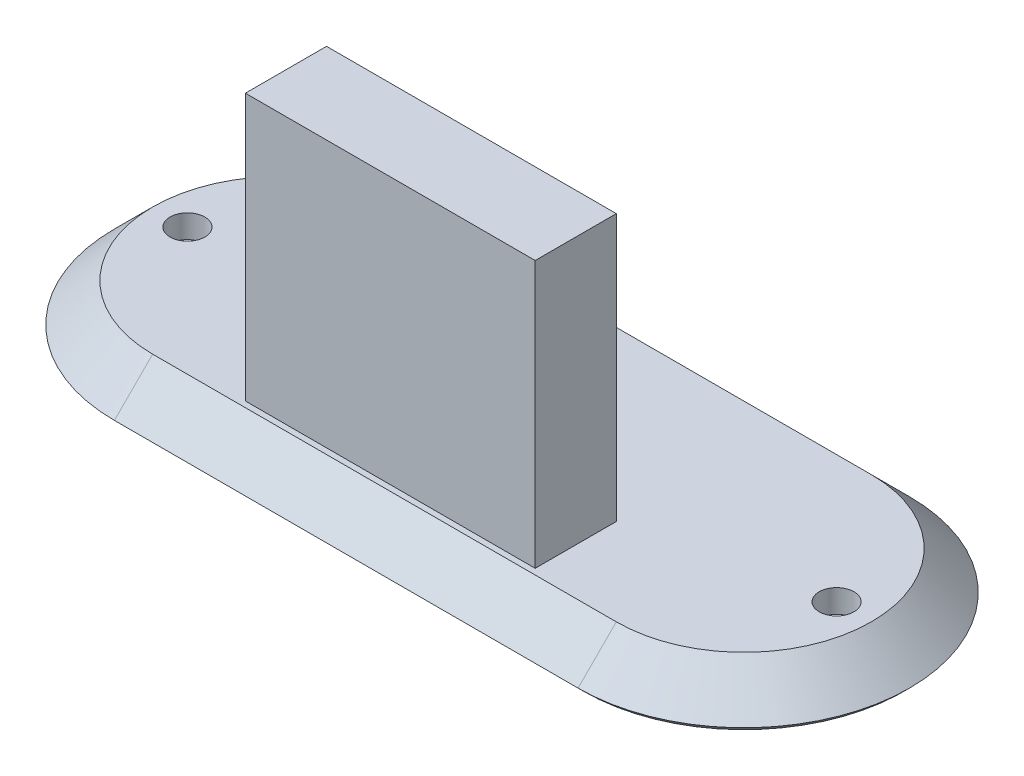
ISO-10303-21;
HEADER;
FILE_DESCRIPTION(('STEP AP214'),'2;1');
FILE_NAME('part.step','',(''),(''),'','','');
FILE_SCHEMA(('AUTOMOTIVE_DESIGN { 1 0 10303 214 1 1 1 1 }'));
ENDSEC;
DATA;
#1=APPLICATION_CONTEXT('core data for automotive mechanical design processes');
#2=APPLICATION_PROTOCOL_DEFINITION('international standard','automotive_design',2000,#1);
#3=PRODUCT_CONTEXT('',#1,'mechanical');
#4=PRODUCT('Part','Part','',(#3));
#5=PRODUCT_RELATED_PRODUCT_CATEGORY('part','',(#4));
#6=PRODUCT_DEFINITION_FORMATION('','',#4);
#7=PRODUCT_DEFINITION_CONTEXT('part definition',#1,'design');
#8=PRODUCT_DEFINITION('design','',#6,#7);
#9=PRODUCT_DEFINITION_SHAPE('','',#8);
#10=(LENGTH_UNIT() NAMED_UNIT(*) SI_UNIT(.MILLI.,.METRE.));
#11=(NAMED_UNIT(*) PLANE_ANGLE_UNIT() SI_UNIT($,.RADIAN.));
#12=(NAMED_UNIT(*) SI_UNIT($,.STERADIAN.) SOLID_ANGLE_UNIT());
#13=UNCERTAINTY_MEASURE_WITH_UNIT(LENGTH_MEASURE(1.E-05),#10,'distance_accuracy_value','');
#14=(GEOMETRIC_REPRESENTATION_CONTEXT(3) GLOBAL_UNCERTAINTY_ASSIGNED_CONTEXT((#13)) GLOBAL_UNIT_ASSIGNED_CONTEXT((#10,
#11,#12)) REPRESENTATION_CONTEXT('',''));
#15=CARTESIAN_POINT('',(0.,0.,0.));
#16=DIRECTION('',(0.,0.,1.));
#17=DIRECTION('',(1.,0.,0.));
#18=AXIS2_PLACEMENT_3D('',#15,#16,#17);
#19=CARTESIAN_POINT('',(-20.,3.8,0.));
#20=DIRECTION('',(0.,1.,0.));
#21=DIRECTION('',(0.,0.,1.));
#22=AXIS2_PLACEMENT_3D('',#19,#20,#21);
#23=PLANE('',#22);
#24=DIRECTION('',(0.,0.,1.));
#25=VECTOR('',#24,1.);
#26=CARTESIAN_POINT('',(-8.,3.8,8.5));
#27=LINE('',#26,#25);
#28=CARTESIAN_POINT('',(-8.,3.8,6.5));
#29=VERTEX_POINT('',#28);
#30=CARTESIAN_POINT('',(-8.,3.8,8.5));
#31=VERTEX_POINT('',#30);
#32=EDGE_CURVE('E58',#29,#31,#27,.T.);
#33=ORIENTED_EDGE('',*,*,#32,.F.);
#34=DIRECTION('',(-1.,0.,0.));
#35=VECTOR('',#34,1.);
#36=CARTESIAN_POINT('',(-8.,3.8,6.5));
#37=LINE('',#36,#35);
#38=CARTESIAN_POINT('',(8.,3.8,6.5));
#39=VERTEX_POINT('',#38);
#40=EDGE_CURVE('E201',#39,#29,#37,.T.);
#41=ORIENTED_EDGE('',*,*,#40,.F.);
#42=DIRECTION('',(0.,0.,-1.));
#43=VECTOR('',#42,1.);
#44=CARTESIAN_POINT('',(8.,3.8,8.5));
#45=LINE('',#44,#43);
#46=CARTESIAN_POINT('',(8.,3.8,8.5));
#47=VERTEX_POINT('',#46);
#48=EDGE_CURVE('E204',#47,#39,#45,.T.);
#49=ORIENTED_EDGE('',*,*,#48,.F.);
#50=DIRECTION('',(-1.,0.,0.));
#51=VECTOR('',#50,1.);
#52=CARTESIAN_POINT('',(-10.5,3.8,8.5));
#53=LINE('',#52,#51);
#54=CARTESIAN_POINT('',(10.5,3.8,8.5));
#55=VERTEX_POINT('',#54);
#56=EDGE_CURVE('E244',#55,#47,#53,.T.);
#57=ORIENTED_EDGE('',*,*,#56,.F.);
#58=DIRECTION('',(0.,0.,1.));
#59=VECTOR('',#58,1.);
#60=CARTESIAN_POINT('',(10.5,3.8,8.5));
#61=LINE('',#60,#59);
#62=CARTESIAN_POINT('',(10.5,3.8,3.5));
#63=VERTEX_POINT('',#62);
#64=EDGE_CURVE('E390',#63,#55,#61,.T.);
#65=ORIENTED_EDGE('',*,*,#64,.F.);
#66=DIRECTION('',(-1.,0.,0.));
#67=VECTOR('',#66,1.);
#68=CARTESIAN_POINT('',(10.5,3.8,3.5));
#69=LINE('',#68,#67);
#70=CARTESIAN_POINT('',(12.5,3.8,3.5));
#71=VERTEX_POINT('',#70);
#72=EDGE_CURVE('E388',#71,#63,#69,.T.);
#73=ORIENTED_EDGE('',*,*,#72,.F.);
#74=DIRECTION('',(0.,0.,-1.));
#75=VECTOR('',#74,1.);
#76=CARTESIAN_POINT('',(12.5,3.8,3.5));
#77=LINE('',#76,#75);
#78=CARTESIAN_POINT('',(12.5,3.8,10.5));
#79=VERTEX_POINT('',#78);
#80=EDGE_CURVE('E379',#79,#71,#77,.T.);
#81=ORIENTED_EDGE('',*,*,#80,.F.);
#82=DIRECTION('',(1.,0.,0.));
#83=VECTOR('',#82,1.);
#84=CARTESIAN_POINT('',(-12.5,3.8,10.5));
#85=LINE('',#84,#83);
#86=CARTESIAN_POINT('',(-12.5,3.8,10.5));
#87=VERTEX_POINT('',#86);
#88=EDGE_CURVE('E386',#87,#79,#85,.T.);
#89=ORIENTED_EDGE('',*,*,#88,.F.);
#90=DIRECTION('',(0.,0.,1.));
#91=VECTOR('',#90,1.);
#92=CARTESIAN_POINT('',(-12.5,3.8,3.5));
#93=LINE('',#92,#91);
#94=CARTESIAN_POINT('',(-12.5,3.8,3.5));
#95=VERTEX_POINT('',#94);
#96=EDGE_CURVE('E392',#95,#87,#93,.T.);
#97=ORIENTED_EDGE('',*,*,#96,.F.);
#98=DIRECTION('',(-1.,0.,0.));
#99=VECTOR('',#98,1.);
#100=CARTESIAN_POINT('',(-10.5,3.8,3.5));
#101=LINE('',#100,#99);
#102=CARTESIAN_POINT('',(-10.5,3.8,3.5));
#103=VERTEX_POINT('',#102);
#104=EDGE_CURVE('E405',#103,#95,#101,.T.);
#105=ORIENTED_EDGE('',*,*,#104,.F.);
#106=DIRECTION('',(0.,0.,-1.));
#107=VECTOR('',#106,1.);
#108=CARTESIAN_POINT('',(-10.5,3.8,8.5));
#109=LINE('',#108,#107);
#110=CARTESIAN_POINT('',(-10.5,3.8,8.5));
#111=VERTEX_POINT('',#110);
#112=EDGE_CURVE('E230',#111,#103,#109,.T.);
#113=ORIENTED_EDGE('',*,*,#112,.F.);
#114=EDGE_CURVE('E396',#31,#111,#53,.T.);
#115=ORIENTED_EDGE('',*,*,#114,.F.);
#116=EDGE_LOOP('',(#33,#41,#49,#57,#65,#73,#81,#89,#97,#105,#113,#115));
#117=FACE_BOUND('',#116,.T.);
#118=CARTESIAN_POINT('',(28.,3.8,0.));
#119=DIRECTION('',(0.,1.,0.));
#120=DIRECTION('',(0.,0.,-1.));
#121=AXIS2_PLACEMENT_3D('',#118,#119,#120);
#122=CIRCLE('',#121,1.5);
#123=CARTESIAN_POINT('',(28.,3.8,1.49999999999998));
#124=VERTEX_POINT('',#123);
#125=EDGE_CURVE('E248',#124,#124,#122,.T.);
#126=ORIENTED_EDGE('',*,*,#125,.F.);
#127=EDGE_LOOP('',(#126));
#128=FACE_BOUND('',#127,.T.);
#129=CARTESIAN_POINT('',(-28.,3.8,0.));
#130=DIRECTION('',(0.,1.,0.));
#131=DIRECTION('',(0.,0.,1.));
#132=AXIS2_PLACEMENT_3D('',#129,#130,#131);
#133=CIRCLE('',#132,1.5);
#134=CARTESIAN_POINT('',(-28.,3.8,1.5));
#135=VERTEX_POINT('',#134);
#136=EDGE_CURVE('E268',#135,#135,#133,.T.);
#137=ORIENTED_EDGE('',*,*,#136,.F.);
#138=EDGE_LOOP('',(#137));
#139=FACE_BOUND('',#138,.T.);
#140=CARTESIAN_POINT('',(-20.,3.8,0.));
#141=DIRECTION('',(0.,1.,0.));
#142=DIRECTION('',(0.,0.,1.));
#143=AXIS2_PLACEMENT_3D('',#140,#141,#142);
#144=CIRCLE('',#143,11.);
#145=CARTESIAN_POINT('',(-20.,3.8,-11.));
#146=VERTEX_POINT('',#145);
#147=CARTESIAN_POINT('',(-20.,3.8,11.));
#148=VERTEX_POINT('',#147);
#149=EDGE_CURVE('E278',#146,#148,#144,.T.);
#150=ORIENTED_EDGE('',*,*,#149,.T.);
#151=DIRECTION('',(-1.,0.,0.));
#152=VECTOR('',#151,1.);
#153=CARTESIAN_POINT('',(-20.,3.8,11.));
#154=LINE('',#153,#152);
#155=CARTESIAN_POINT('',(20.,3.8,11.));
#156=VERTEX_POINT('',#155);
#157=EDGE_CURVE('E324',#148,#156,#154,.F.);
#158=ORIENTED_EDGE('',*,*,#157,.T.);
#159=CARTESIAN_POINT('',(20.,3.8,0.));
#160=DIRECTION('',(0.,1.,0.));
#161=DIRECTION('',(0.,0.,1.));
#162=AXIS2_PLACEMENT_3D('',#159,#160,#161);
#163=CIRCLE('',#162,11.);
#164=CARTESIAN_POINT('',(20.,3.8,-11.));
#165=VERTEX_POINT('',#164);
#166=EDGE_CURVE('E326',#156,#165,#163,.T.);
#167=ORIENTED_EDGE('',*,*,#166,.T.);
#168=DIRECTION('',(1.,0.,0.));
#169=VECTOR('',#168,1.);
#170=CARTESIAN_POINT('',(-20.,3.8,-11.));
#171=LINE('',#170,#169);
#172=EDGE_CURVE('E317',#165,#146,#171,.F.);
#173=ORIENTED_EDGE('',*,*,#172,.T.);
#174=EDGE_LOOP('',(#150,#158,#167,#173));
#175=FACE_BOUND('',#174,.T.);
#176=ADVANCED_FACE('F33',(#117,#128,#139,#175),#23,.T.);
#177=CARTESIAN_POINT('',(-20.,0.,0.));
#178=DIRECTION('',(0.,-1.,0.));
#179=DIRECTION('',(0.,0.,1.));
#180=AXIS2_PLACEMENT_3D('',#177,#178,#179);
#181=CONICAL_SURFACE('',#180,14.8,0.78539816339745);
#182=DIRECTION('',(0.,-0.707106781186546,-0.707106781186549));
#183=VECTOR('',#182,1.);
#184=CARTESIAN_POINT('',(-20.,0.,-14.8));
#185=LINE('',#184,#183);
#186=CARTESIAN_POINT('',(-20.,0.500000000000007,-14.3));
#187=VERTEX_POINT('',#186);
#188=EDGE_CURVE('E313',#146,#187,#185,.T.);
#189=ORIENTED_EDGE('',*,*,#188,.T.);
#190=CARTESIAN_POINT('',(-20.,0.500000000000007,0.));
#191=DIRECTION('',(0.,1.,0.));
#192=DIRECTION('',(0.,0.,1.));
#193=AXIS2_PLACEMENT_3D('',#190,#191,#192);
#194=CIRCLE('',#193,14.3);
#195=CARTESIAN_POINT('',(-20.,0.500000000000011,14.3));
#196=VERTEX_POINT('',#195);
#197=EDGE_CURVE('E311',#187,#196,#194,.T.);
#198=ORIENTED_EDGE('',*,*,#197,.T.);
#199=DIRECTION('',(0.,-0.707106781186546,0.707106781186549));
#200=VECTOR('',#199,1.);
#201=CARTESIAN_POINT('',(-20.,0.,14.8));
#202=LINE('',#201,#200);
#203=EDGE_CURVE('E308',#148,#196,#202,.T.);
#204=ORIENTED_EDGE('',*,*,#203,.F.);
#205=ORIENTED_EDGE('',*,*,#149,.F.);
#206=EDGE_LOOP('',(#189,#198,#204,#205));
#207=FACE_BOUND('',#206,.T.);
#208=ADVANCED_FACE('F429',(#207),#181,.T.);
#209=CARTESIAN_POINT('',(-20.,0.,14.8));
#210=DIRECTION('',(0.,0.707106781186549,0.707106781186546));
#211=DIRECTION('',(0.,-0.707106781186546,0.707106781186549));
#212=AXIS2_PLACEMENT_3D('',#209,#210,#211);
#213=PLANE('',#212);
#214=ORIENTED_EDGE('',*,*,#203,.T.);
#215=DIRECTION('',(-1.,0.,0.));
#216=VECTOR('',#215,1.);
#217=CARTESIAN_POINT('',(-20.,0.500000000000009,14.3));
#218=LINE('',#217,#216);
#219=CARTESIAN_POINT('',(20.,0.500000000000007,14.3));
#220=VERTEX_POINT('',#219);
#221=EDGE_CURVE('E340',#196,#220,#218,.F.);
#222=ORIENTED_EDGE('',*,*,#221,.T.);
#223=DIRECTION('',(0.,-0.707106781186546,0.707106781186549));
#224=VECTOR('',#223,1.);
#225=CARTESIAN_POINT('',(20.,0.,14.8));
#226=LINE('',#225,#224);
#227=EDGE_CURVE('E312',#156,#220,#226,.T.);
#228=ORIENTED_EDGE('',*,*,#227,.F.);
#229=ORIENTED_EDGE('',*,*,#157,.F.);
#230=EDGE_LOOP('',(#214,#222,#228,#229));
#231=FACE_BOUND('',#230,.T.);
#232=ADVANCED_FACE('F436',(#231),#213,.T.);
#233=CARTESIAN_POINT('',(20.,0.,0.));
#234=DIRECTION('',(0.,-1.,0.));
#235=DIRECTION('',(0.,0.,1.));
#236=AXIS2_PLACEMENT_3D('',#233,#234,#235);
#237=CONICAL_SURFACE('',#236,14.8,0.78539816339745);
#238=ORIENTED_EDGE('',*,*,#227,.T.);
#239=CARTESIAN_POINT('',(20.,0.500000000000007,0.));
#240=DIRECTION('',(0.,1.,0.));
#241=DIRECTION('',(0.,0.,1.));
#242=AXIS2_PLACEMENT_3D('',#239,#240,#241);
#243=CIRCLE('',#242,14.3);
#244=CARTESIAN_POINT('',(20.,0.500000000000007,-14.3));
#245=VERTEX_POINT('',#244);
#246=EDGE_CURVE('E11',#220,#245,#243,.T.);
#247=ORIENTED_EDGE('',*,*,#246,.T.);
#248=DIRECTION('',(0.,-0.707106781186546,-0.707106781186549));
#249=VECTOR('',#248,1.);
#250=CARTESIAN_POINT('',(20.,0.,-14.8));
#251=LINE('',#250,#249);
#252=EDGE_CURVE('E316',#165,#245,#251,.T.);
#253=ORIENTED_EDGE('',*,*,#252,.F.);
#254=ORIENTED_EDGE('',*,*,#166,.F.);
#255=EDGE_LOOP('',(#238,#247,#253,#254));
#256=FACE_BOUND('',#255,.T.);
#257=ADVANCED_FACE('F450',(#256),#237,.T.);
#258=CARTESIAN_POINT('',(-20.,0.,-14.8));
#259=DIRECTION('',(0.,0.707106781186549,-0.707106781186546));
#260=DIRECTION('',(0.,0.707106781186546,0.707106781186549));
#261=AXIS2_PLACEMENT_3D('',#258,#259,#260);
#262=PLANE('',#261);
#263=ORIENTED_EDGE('',*,*,#252,.T.);
#264=DIRECTION('',(1.,0.,0.));
#265=VECTOR('',#264,1.);
#266=CARTESIAN_POINT('',(-20.,0.500000000000009,-14.3));
#267=LINE('',#266,#265);
#268=EDGE_CURVE('E42',#245,#187,#267,.F.);
#269=ORIENTED_EDGE('',*,*,#268,.T.);
#270=ORIENTED_EDGE('',*,*,#188,.F.);
#271=ORIENTED_EDGE('',*,*,#172,.F.);
#272=EDGE_LOOP('',(#263,#269,#270,#271));
#273=FACE_BOUND('',#272,.T.);
#274=ADVANCED_FACE('F445',(#273),#262,.T.);
#275=CARTESIAN_POINT('',(-20.,0.,0.));
#276=DIRECTION('',(0.,1.,0.));
#277=DIRECTION('',(0.,0.,1.));
#278=AXIS2_PLACEMENT_3D('',#275,#276,#277);
#279=PLANE('',#278);
#280=DIRECTION('',(-1.,0.,0.));
#281=VECTOR('',#280,1.);
#282=CARTESIAN_POINT('',(-20.,0.,13.8));
#283=LINE('',#282,#281);
#284=CARTESIAN_POINT('',(20.,0.,13.8));
#285=VERTEX_POINT('',#284);
#286=CARTESIAN_POINT('',(-20.,0.,13.8));
#287=VERTEX_POINT('',#286);
#288=EDGE_CURVE('E335',#285,#287,#283,.T.);
#289=ORIENTED_EDGE('',*,*,#288,.T.);
#290=CARTESIAN_POINT('',(-20.,0.,0.));
#291=DIRECTION('',(0.,1.,0.));
#292=DIRECTION('',(0.,0.,1.));
#293=AXIS2_PLACEMENT_3D('',#290,#291,#292);
#294=CIRCLE('',#293,13.8);
#295=CARTESIAN_POINT('',(-20.,0.,-13.8));
#296=VERTEX_POINT('',#295);
#297=EDGE_CURVE('E337',#287,#296,#294,.F.);
#298=ORIENTED_EDGE('',*,*,#297,.T.);
#299=DIRECTION('',(1.,0.,0.));
#300=VECTOR('',#299,1.);
#301=CARTESIAN_POINT('',(-20.,0.,-13.8));
#302=LINE('',#301,#300);
#303=CARTESIAN_POINT('',(20.,0.,-13.8));
#304=VERTEX_POINT('',#303);
#305=EDGE_CURVE('E333',#296,#304,#302,.T.);
#306=ORIENTED_EDGE('',*,*,#305,.T.);
#307=CARTESIAN_POINT('',(20.,0.,0.));
#308=DIRECTION('',(0.,1.,0.));
#309=DIRECTION('',(0.,0.,1.));
#310=AXIS2_PLACEMENT_3D('',#307,#308,#309);
#311=CIRCLE('',#310,13.8);
#312=EDGE_CURVE('E331',#304,#285,#311,.F.);
#313=ORIENTED_EDGE('',*,*,#312,.T.);
#314=EDGE_LOOP('',(#289,#298,#306,#313));
#315=FACE_BOUND('',#314,.T.);
#316=DIRECTION('',(1.,0.,0.));
#317=VECTOR('',#316,1.);
#318=CARTESIAN_POINT('',(-20.,0.,-11.9715728752538));
#319=LINE('',#318,#317);
#320=CARTESIAN_POINT('',(20.,0.,-11.9715728752538));
#321=VERTEX_POINT('',#320);
#322=CARTESIAN_POINT('',(-20.,0.,-11.9715728752538));
#323=VERTEX_POINT('',#322);
#324=EDGE_CURVE('E284',#321,#323,#319,.F.);
#325=ORIENTED_EDGE('',*,*,#324,.T.);
#326=CARTESIAN_POINT('',(-20.,0.,0.));
#327=DIRECTION('',(0.,1.,0.));
#328=DIRECTION('',(0.,0.,1.));
#329=AXIS2_PLACEMENT_3D('',#326,#327,#328);
#330=CIRCLE('',#329,11.9715728752538);
#331=CARTESIAN_POINT('',(-20.,0.,11.9715728752538));
#332=VERTEX_POINT('',#331);
#333=EDGE_CURVE('E296',#323,#332,#330,.T.);
#334=ORIENTED_EDGE('',*,*,#333,.T.);
#335=DIRECTION('',(-1.,0.,0.));
#336=VECTOR('',#335,1.);
#337=CARTESIAN_POINT('',(-20.,0.,11.9715728752538));
#338=LINE('',#337,#336);
#339=CARTESIAN_POINT('',(20.,0.,11.9715728752538));
#340=VERTEX_POINT('',#339);
#341=EDGE_CURVE('E299',#332,#340,#338,.F.);
#342=ORIENTED_EDGE('',*,*,#341,.T.);
#343=CARTESIAN_POINT('',(20.,0.,0.));
#344=DIRECTION('',(0.,1.,0.));
#345=DIRECTION('',(0.,0.,1.));
#346=AXIS2_PLACEMENT_3D('',#343,#344,#345);
#347=CIRCLE('',#346,11.9715728752538);
#348=EDGE_CURVE('E303',#340,#321,#347,.T.);
#349=ORIENTED_EDGE('',*,*,#348,.T.);
#350=EDGE_LOOP('',(#325,#334,#342,#349));
#351=FACE_BOUND('',#350,.T.);
#352=ADVANCED_FACE('F442',(#315,#351),#279,.F.);
#353=CARTESIAN_POINT('',(-20.,-1.4142135623731,0.));
#354=DIRECTION('',(0.,-1.,0.));
#355=DIRECTION('',(0.,0.,1.));
#356=AXIS2_PLACEMENT_3D('',#353,#354,#355);
#357=CONICAL_SURFACE('',#356,13.3857864376269,0.78539816339745);
#358=ORIENTED_EDGE('',*,*,#333,.F.);
#359=DIRECTION('',(0.,-0.707106781186546,-0.707106781186549));
#360=VECTOR('',#359,1.);
#361=CARTESIAN_POINT('',(-20.,-1.4142135623731,-13.3857864376269));
#362=LINE('',#361,#360);
#363=CARTESIAN_POINT('',(-20.,1.8,-10.1715728752538));
#364=VERTEX_POINT('',#363);
#365=EDGE_CURVE('E285',#364,#323,#362,.T.);
#366=ORIENTED_EDGE('',*,*,#365,.F.);
#367=CARTESIAN_POINT('',(-20.,1.8,0.));
#368=DIRECTION('',(0.,1.,0.));
#369=DIRECTION('',(0.,0.,1.));
#370=AXIS2_PLACEMENT_3D('',#367,#368,#369);
#371=CIRCLE('',#370,10.1715728752538);
#372=CARTESIAN_POINT('',(-20.,1.8,10.1715728752538));
#373=VERTEX_POINT('',#372);
#374=EDGE_CURVE('E280',#364,#373,#371,.T.);
#375=ORIENTED_EDGE('',*,*,#374,.T.);
#376=DIRECTION('',(0.,-0.707106781186546,0.707106781186549));
#377=VECTOR('',#376,1.);
#378=CARTESIAN_POINT('',(-20.,-1.4142135623731,13.3857864376269));
#379=LINE('',#378,#377);
#380=EDGE_CURVE('E275',#373,#332,#379,.T.);
#381=ORIENTED_EDGE('',*,*,#380,.T.);
#382=EDGE_LOOP('',(#358,#366,#375,#381));
#383=FACE_BOUND('',#382,.T.);
#384=ADVANCED_FACE('F444',(#383),#357,.F.);
#385=CARTESIAN_POINT('',(-20.,-1.4142135623731,13.3857864376269));
#386=DIRECTION('',(0.,0.707106781186549,0.707106781186546));
#387=DIRECTION('',(0.,-0.707106781186546,0.707106781186549));
#388=AXIS2_PLACEMENT_3D('',#385,#386,#387);
#389=PLANE('',#388);
#390=ORIENTED_EDGE('',*,*,#341,.F.);
#391=ORIENTED_EDGE('',*,*,#380,.F.);
#392=DIRECTION('',(-1.,0.,0.));
#393=VECTOR('',#392,1.);
#394=CARTESIAN_POINT('',(-20.,1.8,10.1715728752538));
#395=LINE('',#394,#393);
#396=CARTESIAN_POINT('',(20.,1.8,10.1715728752538));
#397=VERTEX_POINT('',#396);
#398=EDGE_CURVE('E283',#373,#397,#395,.F.);
#399=ORIENTED_EDGE('',*,*,#398,.T.);
#400=DIRECTION('',(0.,-0.707106781186546,0.707106781186549));
#401=VECTOR('',#400,1.);
#402=CARTESIAN_POINT('',(20.,-1.4142135623731,13.3857864376269));
#403=LINE('',#402,#401);
#404=EDGE_CURVE('E279',#397,#340,#403,.T.);
#405=ORIENTED_EDGE('',*,*,#404,.T.);
#406=EDGE_LOOP('',(#390,#391,#399,#405));
#407=FACE_BOUND('',#406,.T.);
#408=ADVANCED_FACE('F504',(#407),#389,.F.);
#409=CARTESIAN_POINT('',(20.,-1.4142135623731,0.));
#410=DIRECTION('',(0.,-1.,0.));
#411=DIRECTION('',(0.,0.,1.));
#412=AXIS2_PLACEMENT_3D('',#409,#410,#411);
#413=CONICAL_SURFACE('',#412,13.3857864376269,0.78539816339745);
#414=ORIENTED_EDGE('',*,*,#348,.F.);
#415=ORIENTED_EDGE('',*,*,#404,.F.);
#416=CARTESIAN_POINT('',(20.,1.8,0.));
#417=DIRECTION('',(0.,1.,0.));
#418=DIRECTION('',(0.,0.,1.));
#419=AXIS2_PLACEMENT_3D('',#416,#417,#418);
#420=CIRCLE('',#419,10.1715728752538);
#421=CARTESIAN_POINT('',(20.,1.8,-10.1715728752538));
#422=VERTEX_POINT('',#421);
#423=EDGE_CURVE('E292',#397,#422,#420,.T.);
#424=ORIENTED_EDGE('',*,*,#423,.T.);
#425=DIRECTION('',(0.,0.707106781186546,0.707106781186549));
#426=VECTOR('',#425,1.);
#427=CARTESIAN_POINT('',(20.,-1.41421356237309,-13.3857864376269));
#428=LINE('',#427,#426);
#429=EDGE_CURVE('E287',#422,#321,#428,.F.);
#430=ORIENTED_EDGE('',*,*,#429,.T.);
#431=EDGE_LOOP('',(#414,#415,#424,#430));
#432=FACE_BOUND('',#431,.T.);
#433=ADVANCED_FACE('F508',(#432),#413,.F.);
#434=CARTESIAN_POINT('',(-20.,-1.4142135623731,-13.3857864376269));
#435=DIRECTION('',(0.,0.707106781186549,-0.707106781186546));
#436=DIRECTION('',(0.,0.707106781186546,0.707106781186549));
#437=AXIS2_PLACEMENT_3D('',#434,#435,#436);
#438=PLANE('',#437);
#439=ORIENTED_EDGE('',*,*,#324,.F.);
#440=ORIENTED_EDGE('',*,*,#429,.F.);
#441=DIRECTION('',(1.,0.,0.));
#442=VECTOR('',#441,1.);
#443=CARTESIAN_POINT('',(-20.,1.8,-10.1715728752538));
#444=LINE('',#443,#442);
#445=EDGE_CURVE('E288',#422,#364,#444,.F.);
#446=ORIENTED_EDGE('',*,*,#445,.T.);
#447=ORIENTED_EDGE('',*,*,#365,.T.);
#448=EDGE_LOOP('',(#439,#440,#446,#447));
#449=FACE_BOUND('',#448,.T.);
#450=ADVANCED_FACE('F497',(#449),#438,.F.);
#451=CARTESIAN_POINT('',(-20.,1.8,0.));
#452=DIRECTION('',(0.,1.,0.));
#453=DIRECTION('',(0.,0.,1.));
#454=AXIS2_PLACEMENT_3D('',#451,#452,#453);
#455=PLANE('',#454);
#456=DIRECTION('',(-1.,0.,0.));
#457=VECTOR('',#456,1.);
#458=CARTESIAN_POINT('',(-8.,1.8,6.5));
#459=LINE('',#458,#457);
#460=CARTESIAN_POINT('',(8.,1.8,6.5));
#461=VERTEX_POINT('',#460);
#462=CARTESIAN_POINT('',(-8.,1.8,6.5));
#463=VERTEX_POINT('',#462);
#464=EDGE_CURVE('E190',#461,#463,#459,.T.);
#465=ORIENTED_EDGE('',*,*,#464,.T.);
#466=DIRECTION('',(0.,0.,1.));
#467=VECTOR('',#466,1.);
#468=CARTESIAN_POINT('',(-8.,1.8,8.5));
#469=LINE('',#468,#467);
#470=CARTESIAN_POINT('',(-8.,1.8,8.5));
#471=VERTEX_POINT('',#470);
#472=EDGE_CURVE('E185',#463,#471,#469,.T.);
#473=ORIENTED_EDGE('',*,*,#472,.T.);
#474=DIRECTION('',(1.,0.,0.));
#475=VECTOR('',#474,1.);
#476=CARTESIAN_POINT('',(-8.,1.8,8.5));
#477=LINE('',#476,#475);
#478=CARTESIAN_POINT('',(8.,1.8,8.5));
#479=VERTEX_POINT('',#478);
#480=EDGE_CURVE('E193',#471,#479,#477,.T.);
#481=ORIENTED_EDGE('',*,*,#480,.T.);
#482=DIRECTION('',(0.,0.,-1.));
#483=VECTOR('',#482,1.);
#484=CARTESIAN_POINT('',(8.,1.8,8.5));
#485=LINE('',#484,#483);
#486=EDGE_CURVE('E50',#479,#461,#485,.T.);
#487=ORIENTED_EDGE('',*,*,#486,.T.);
#488=EDGE_LOOP('',(#465,#473,#481,#487));
#489=FACE_BOUND('',#488,.T.);
#490=CARTESIAN_POINT('',(28.,1.8,0.));
#491=DIRECTION('',(0.,1.,0.));
#492=DIRECTION('',(0.,0.,1.));
#493=AXIS2_PLACEMENT_3D('',#490,#491,#492);
#494=CIRCLE('',#493,1.5);
#495=CARTESIAN_POINT('',(28.,1.8,1.49999999999998));
#496=VERTEX_POINT('',#495);
#497=EDGE_CURVE('E253',#496,#496,#494,.F.);
#498=ORIENTED_EDGE('',*,*,#497,.F.);
#499=EDGE_LOOP('',(#498));
#500=FACE_BOUND('',#499,.T.);
#501=CARTESIAN_POINT('',(-28.,1.8,0.));
#502=DIRECTION('',(0.,1.,0.));
#503=DIRECTION('',(0.,0.,1.));
#504=AXIS2_PLACEMENT_3D('',#501,#502,#503);
#505=CIRCLE('',#504,1.5);
#506=CARTESIAN_POINT('',(-28.,1.8,1.5));
#507=VERTEX_POINT('',#506);
#508=EDGE_CURVE('E271',#507,#507,#505,.F.);
#509=ORIENTED_EDGE('',*,*,#508,.F.);
#510=EDGE_LOOP('',(#509));
#511=FACE_BOUND('',#510,.T.);
#512=ORIENTED_EDGE('',*,*,#374,.F.);
#513=ORIENTED_EDGE('',*,*,#445,.F.);
#514=ORIENTED_EDGE('',*,*,#423,.F.);
#515=ORIENTED_EDGE('',*,*,#398,.F.);
#516=EDGE_LOOP('',(#512,#513,#514,#515));
#517=FACE_BOUND('',#516,.T.);
#518=ADVANCED_FACE('F198',(#489,#500,#511,#517),#455,.F.);
#519=CARTESIAN_POINT('',(20.,0.500000000000009,0.));
#520=DIRECTION('',(0.,1.,0.));
#521=DIRECTION('',(0.,0.,1.));
#522=AXIS2_PLACEMENT_3D('',#519,#520,#521);
#523=CONICAL_SURFACE('',#522,14.3,0.785398163397441);
#524=DIRECTION('',(0.,0.707106781186553,0.707106781186543));
#525=VECTOR('',#524,1.);
#526=CARTESIAN_POINT('',(20.,0.,13.8));
#527=LINE('',#526,#525);
#528=EDGE_CURVE('E346',#285,#220,#527,.T.);
#529=ORIENTED_EDGE('',*,*,#528,.F.);
#530=ORIENTED_EDGE('',*,*,#312,.F.);
#531=DIRECTION('',(0.,-0.707106781186552,0.707106781186543));
#532=VECTOR('',#531,1.);
#533=CARTESIAN_POINT('',(20.,0.500000000000009,-14.3));
#534=LINE('',#533,#532);
#535=EDGE_CURVE('E300',#245,#304,#534,.T.);
#536=ORIENTED_EDGE('',*,*,#535,.F.);
#537=ORIENTED_EDGE('',*,*,#246,.F.);
#538=EDGE_LOOP('',(#529,#530,#536,#537));
#539=FACE_BOUND('',#538,.T.);
#540=ADVANCED_FACE('F35',(#539),#523,.T.);
#541=CARTESIAN_POINT('',(-20.,0.500000000000009,-14.3));
#542=DIRECTION('',(0.,-0.707106781186542,-0.707106781186553));
#543=DIRECTION('',(1.,0.,0.));
#544=AXIS2_PLACEMENT_3D('',#541,#542,#543);
#545=PLANE('',#544);
#546=ORIENTED_EDGE('',*,*,#535,.T.);
#547=ORIENTED_EDGE('',*,*,#305,.F.);
#548=DIRECTION('',(0.,-0.707106781186552,0.707106781186543));
#549=VECTOR('',#548,1.);
#550=CARTESIAN_POINT('',(-20.,0.500000000000009,-14.3));
#551=LINE('',#550,#549);
#552=EDGE_CURVE('E344',#187,#296,#551,.T.);
#553=ORIENTED_EDGE('',*,*,#552,.F.);
#554=ORIENTED_EDGE('',*,*,#268,.F.);
#555=EDGE_LOOP('',(#546,#547,#553,#554));
#556=FACE_BOUND('',#555,.T.);
#557=ADVANCED_FACE('F464',(#556),#545,.T.);
#558=CARTESIAN_POINT('',(-20.,0.500000000000009,14.3));
#559=DIRECTION('',(0.,-0.707106781186542,0.707106781186553));
#560=DIRECTION('',(-1.,0.,0.));
#561=AXIS2_PLACEMENT_3D('',#558,#559,#560);
#562=PLANE('',#561);
#563=ORIENTED_EDGE('',*,*,#528,.T.);
#564=ORIENTED_EDGE('',*,*,#221,.F.);
#565=DIRECTION('',(0.,0.707106781186552,0.707106781186543));
#566=VECTOR('',#565,1.);
#567=CARTESIAN_POINT('',(-20.,0.,13.8));
#568=LINE('',#567,#566);
#569=EDGE_CURVE('E274',#287,#196,#568,.T.);
#570=ORIENTED_EDGE('',*,*,#569,.F.);
#571=ORIENTED_EDGE('',*,*,#288,.F.);
#572=EDGE_LOOP('',(#563,#564,#570,#571));
#573=FACE_BOUND('',#572,.T.);
#574=ADVANCED_FACE('F461',(#573),#562,.T.);
#575=CARTESIAN_POINT('',(-20.,0.500000000000009,0.));
#576=DIRECTION('',(0.,1.,0.));
#577=DIRECTION('',(0.,0.,1.));
#578=AXIS2_PLACEMENT_3D('',#575,#576,#577);
#579=CONICAL_SURFACE('',#578,14.3,0.785398163397441);
#580=ORIENTED_EDGE('',*,*,#552,.T.);
#581=ORIENTED_EDGE('',*,*,#297,.F.);
#582=ORIENTED_EDGE('',*,*,#569,.T.);
#583=ORIENTED_EDGE('',*,*,#197,.F.);
#584=EDGE_LOOP('',(#580,#581,#582,#583));
#585=FACE_BOUND('',#584,.T.);
#586=ADVANCED_FACE('F458',(#585),#579,.T.);
#587=CARTESIAN_POINT('',(-28.,-0.00100000000000013,0.));
#588=DIRECTION('',(0.,1.,0.));
#589=DIRECTION('',(0.,0.,1.));
#590=AXIS2_PLACEMENT_3D('',#587,#588,#589);
#591=CYLINDRICAL_SURFACE('',#590,1.5);
#592=CARTESIAN_POINT('',(-28.,3.8,1.5));
#593=CARTESIAN_POINT('',(-28.,3.77916666666667,1.5));
#594=CARTESIAN_POINT('',(-28.,3.75833333333333,1.5));
#595=CARTESIAN_POINT('',(-28.,3.71666666666667,1.5));
#596=CARTESIAN_POINT('',(-28.,3.69583333333333,1.5));
#597=CARTESIAN_POINT('',(-28.,3.65416666666667,1.5));
#598=CARTESIAN_POINT('',(-28.,3.63333333333333,1.5));
#599=CARTESIAN_POINT('',(-28.,3.59166666666667,1.5));
#600=CARTESIAN_POINT('',(-28.,3.57083333333333,1.5));
#601=CARTESIAN_POINT('',(-28.,3.52916666666667,1.5));
#602=CARTESIAN_POINT('',(-28.,3.50833333333333,1.5));
#603=CARTESIAN_POINT('',(-28.,3.46666666666667,1.5));
#604=CARTESIAN_POINT('',(-28.,3.44583333333333,1.5));
#605=CARTESIAN_POINT('',(-28.,3.40416666666667,1.5));
#606=CARTESIAN_POINT('',(-28.,3.38333333333333,1.5));
#607=CARTESIAN_POINT('',(-28.,3.34166666666667,1.5));
#608=CARTESIAN_POINT('',(-28.,3.32083333333333,1.5));
#609=CARTESIAN_POINT('',(-28.,3.27916666666667,1.5));
#610=CARTESIAN_POINT('',(-28.,3.25833333333333,1.5));
#611=CARTESIAN_POINT('',(-28.,3.21666666666667,1.5));
#612=CARTESIAN_POINT('',(-28.,3.19583333333333,1.5));
#613=CARTESIAN_POINT('',(-28.,3.15416666666667,1.5));
#614=CARTESIAN_POINT('',(-28.,3.13333333333333,1.5));
#615=CARTESIAN_POINT('',(-28.,3.09166666666667,1.5));
#616=CARTESIAN_POINT('',(-28.,3.07083333333333,1.5));
#617=CARTESIAN_POINT('',(-28.,3.02916666666667,1.5));
#618=CARTESIAN_POINT('',(-28.,3.00833333333333,1.5));
#619=CARTESIAN_POINT('',(-28.,2.96666666666667,1.5));
#620=CARTESIAN_POINT('',(-28.,2.94583333333333,1.5));
#621=CARTESIAN_POINT('',(-28.,2.90416666666667,1.5));
#622=CARTESIAN_POINT('',(-28.,2.88333333333333,1.5));
#623=CARTESIAN_POINT('',(-28.,2.84166666666667,1.5));
#624=CARTESIAN_POINT('',(-28.,2.82083333333333,1.5));
#625=CARTESIAN_POINT('',(-28.,2.77916666666667,1.5));
#626=CARTESIAN_POINT('',(-28.,2.75833333333333,1.5));
#627=CARTESIAN_POINT('',(-28.,2.71666666666667,1.5));
#628=CARTESIAN_POINT('',(-28.,2.69583333333333,1.5));
#629=CARTESIAN_POINT('',(-28.,2.65416666666667,1.5));
#630=CARTESIAN_POINT('',(-28.,2.63333333333333,1.5));
#631=CARTESIAN_POINT('',(-28.,2.59166666666667,1.5));
#632=CARTESIAN_POINT('',(-28.,2.57083333333333,1.5));
#633=CARTESIAN_POINT('',(-28.,2.52916666666667,1.5));
#634=CARTESIAN_POINT('',(-28.,2.50833333333333,1.5));
#635=CARTESIAN_POINT('',(-28.,2.46666666666667,1.5));
#636=CARTESIAN_POINT('',(-28.,2.44583333333333,1.5));
#637=CARTESIAN_POINT('',(-28.,2.40416666666667,1.5));
#638=CARTESIAN_POINT('',(-28.,2.38333333333333,1.5));
#639=CARTESIAN_POINT('',(-28.,2.34166666666667,1.5));
#640=CARTESIAN_POINT('',(-28.,2.32083333333333,1.5));
#641=CARTESIAN_POINT('',(-28.,2.27916666666667,1.5));
#642=CARTESIAN_POINT('',(-28.,2.25833333333333,1.5));
#643=CARTESIAN_POINT('',(-28.,2.21666666666667,1.5));
#644=CARTESIAN_POINT('',(-28.,2.19583333333333,1.5));
#645=CARTESIAN_POINT('',(-28.,2.15416666666667,1.5));
#646=CARTESIAN_POINT('',(-28.,2.13333333333333,1.5));
#647=CARTESIAN_POINT('',(-28.,2.09166666666667,1.5));
#648=CARTESIAN_POINT('',(-28.,2.07083333333333,1.5));
#649=CARTESIAN_POINT('',(-28.,2.02916666666667,1.5));
#650=CARTESIAN_POINT('',(-28.,2.00833333333333,1.5));
#651=CARTESIAN_POINT('',(-28.,1.96666666666667,1.5));
#652=CARTESIAN_POINT('',(-28.,1.94583333333333,1.5));
#653=CARTESIAN_POINT('',(-28.,1.90416666666667,1.5));
#654=CARTESIAN_POINT('',(-28.,1.88333333333333,1.5));
#655=CARTESIAN_POINT('',(-28.,1.84166666666667,1.5));
#656=CARTESIAN_POINT('',(-28.,1.82083333333333,1.5));
#657=CARTESIAN_POINT('',(-28.,1.8,1.5));
#658=B_SPLINE_CURVE_WITH_KNOTS('',3,(#592,#593,#594,#595,#596,#597,#598,#599,#600,#601,#602,
#603,#604,#605,#606,#607,#608,#609,#610,#611,#612,#613,#614,#615,#616,#617,#618,#619,#620,#621,
#622,#623,#624,#625,#626,#627,#628,#629,#630,#631,#632,#633,#634,#635,#636,#637,#638,#639,#640,
#641,#642,#643,#644,#645,#646,#647,#648,#649,#650,#651,#652,#653,#654,#655,#656,#657),
.UNSPECIFIED.,.F.,.F.,(4,2,2,2,2,2,2,2,2,2,2,2,2,2,2,2,2,2,2,2,2,2,2,2,2,2,2,2,2,2,2,2,4),(0.,
0.0625000000000001,0.125,0.1875,0.25,0.3125,0.375,0.4375,0.5,0.5625,0.625,0.6875,0.75,0.8125,
0.875,0.9375,1.,1.0625,1.125,1.1875,1.25,1.3125,1.375,1.4375,1.5,1.5625,1.625,1.6875,1.75,
1.8125,1.875,1.9375,2.),.UNSPECIFIED.);
#659=EDGE_CURVE('BSEAM425',#135,#507,#658,.T.);
#660=ORIENTED_EDGE('',*,*,#136,.T.);
#661=ORIENTED_EDGE('',*,*,#508,.T.);
#662=ORIENTED_EDGE('',*,*,#659,.T.);
#663=ORIENTED_EDGE('',*,*,#659,.F.);
#664=EDGE_LOOP('',(#660,#662,#661,#663));
#665=FACE_BOUND('',#664,.T.);
#666=ADVANCED_FACE('F425',(#665),#591,.F.);
#667=CARTESIAN_POINT('',(28.,-0.00100000000000013,0.));
#668=DIRECTION('',(0.,1.,0.));
#669=DIRECTION('',(0.,0.,1.));
#670=AXIS2_PLACEMENT_3D('',#667,#668,#669);
#671=CYLINDRICAL_SURFACE('',#670,1.5);
#672=CARTESIAN_POINT('',(28.,3.8,1.49999999999998));
#673=CARTESIAN_POINT('',(28.,3.77916666666667,1.49999999999998));
#674=CARTESIAN_POINT('',(28.,3.75833333333333,1.49999999999998));
#675=CARTESIAN_POINT('',(28.,3.71666666666667,1.49999999999998));
#676=CARTESIAN_POINT('',(28.,3.69583333333333,1.49999999999998));
#677=CARTESIAN_POINT('',(28.,3.65416666666667,1.49999999999998));
#678=CARTESIAN_POINT('',(28.,3.63333333333333,1.49999999999998));
#679=CARTESIAN_POINT('',(28.,3.59166666666667,1.49999999999998));
#680=CARTESIAN_POINT('',(28.,3.57083333333333,1.49999999999998));
#681=CARTESIAN_POINT('',(28.,3.52916666666667,1.49999999999998));
#682=CARTESIAN_POINT('',(28.,3.50833333333333,1.49999999999998));
#683=CARTESIAN_POINT('',(28.,3.46666666666667,1.49999999999998));
#684=CARTESIAN_POINT('',(28.,3.44583333333333,1.49999999999998));
#685=CARTESIAN_POINT('',(28.,3.40416666666667,1.49999999999998));
#686=CARTESIAN_POINT('',(28.,3.38333333333333,1.49999999999998));
#687=CARTESIAN_POINT('',(28.,3.34166666666667,1.49999999999998));
#688=CARTESIAN_POINT('',(28.,3.32083333333333,1.49999999999998));
#689=CARTESIAN_POINT('',(28.,3.27916666666667,1.49999999999998));
#690=CARTESIAN_POINT('',(28.,3.25833333333333,1.49999999999998));
#691=CARTESIAN_POINT('',(28.,3.21666666666667,1.49999999999998));
#692=CARTESIAN_POINT('',(28.,3.19583333333333,1.49999999999998));
#693=CARTESIAN_POINT('',(28.,3.15416666666667,1.49999999999998));
#694=CARTESIAN_POINT('',(28.,3.13333333333333,1.49999999999998));
#695=CARTESIAN_POINT('',(28.,3.09166666666667,1.49999999999998));
#696=CARTESIAN_POINT('',(28.,3.07083333333333,1.49999999999998));
#697=CARTESIAN_POINT('',(28.,3.02916666666667,1.49999999999998));
#698=CARTESIAN_POINT('',(28.,3.00833333333333,1.49999999999998));
#699=CARTESIAN_POINT('',(28.,2.96666666666667,1.49999999999998));
#700=CARTESIAN_POINT('',(28.,2.94583333333333,1.49999999999998));
#701=CARTESIAN_POINT('',(28.,2.90416666666667,1.49999999999998));
#702=CARTESIAN_POINT('',(28.,2.88333333333333,1.49999999999998));
#703=CARTESIAN_POINT('',(28.,2.84166666666667,1.49999999999998));
#704=CARTESIAN_POINT('',(28.,2.82083333333333,1.49999999999998));
#705=CARTESIAN_POINT('',(28.,2.77916666666667,1.49999999999998));
#706=CARTESIAN_POINT('',(28.,2.75833333333333,1.49999999999998));
#707=CARTESIAN_POINT('',(28.,2.71666666666667,1.49999999999998));
#708=CARTESIAN_POINT('',(28.,2.69583333333333,1.49999999999998));
#709=CARTESIAN_POINT('',(28.,2.65416666666667,1.49999999999998));
#710=CARTESIAN_POINT('',(28.,2.63333333333333,1.49999999999998));
#711=CARTESIAN_POINT('',(28.,2.59166666666667,1.49999999999998));
#712=CARTESIAN_POINT('',(28.,2.57083333333333,1.49999999999998));
#713=CARTESIAN_POINT('',(28.,2.52916666666667,1.49999999999998));
#714=CARTESIAN_POINT('',(28.,2.50833333333333,1.49999999999998));
#715=CARTESIAN_POINT('',(28.,2.46666666666667,1.49999999999998));
#716=CARTESIAN_POINT('',(28.,2.44583333333333,1.49999999999998));
#717=CARTESIAN_POINT('',(28.,2.40416666666667,1.49999999999998));
#718=CARTESIAN_POINT('',(28.,2.38333333333333,1.49999999999998));
#719=CARTESIAN_POINT('',(28.,2.34166666666667,1.49999999999998));
#720=CARTESIAN_POINT('',(28.,2.32083333333333,1.49999999999998));
#721=CARTESIAN_POINT('',(28.,2.27916666666667,1.49999999999998));
#722=CARTESIAN_POINT('',(28.,2.25833333333333,1.49999999999998));
#723=CARTESIAN_POINT('',(28.,2.21666666666667,1.49999999999998));
#724=CARTESIAN_POINT('',(28.,2.19583333333333,1.49999999999998));
#725=CARTESIAN_POINT('',(28.,2.15416666666667,1.49999999999998));
#726=CARTESIAN_POINT('',(28.,2.13333333333333,1.49999999999998));
#727=CARTESIAN_POINT('',(28.,2.09166666666667,1.49999999999998));
#728=CARTESIAN_POINT('',(28.,2.07083333333333,1.49999999999998));
#729=CARTESIAN_POINT('',(28.,2.02916666666667,1.49999999999998));
#730=CARTESIAN_POINT('',(28.,2.00833333333333,1.49999999999998));
#731=CARTESIAN_POINT('',(28.,1.96666666666667,1.49999999999998));
#732=CARTESIAN_POINT('',(28.,1.94583333333333,1.49999999999998));
#733=CARTESIAN_POINT('',(28.,1.90416666666667,1.49999999999998));
#734=CARTESIAN_POINT('',(28.,1.88333333333333,1.49999999999998));
#735=CARTESIAN_POINT('',(28.,1.84166666666667,1.49999999999998));
#736=CARTESIAN_POINT('',(28.,1.82083333333333,1.49999999999998));
#737=CARTESIAN_POINT('',(28.,1.8,1.49999999999998));
#738=B_SPLINE_CURVE_WITH_KNOTS('',3,(#672,#673,#674,#675,#676,#677,#678,#679,#680,#681,#682,
#683,#684,#685,#686,#687,#688,#689,#690,#691,#692,#693,#694,#695,#696,#697,#698,#699,#700,#701,
#702,#703,#704,#705,#706,#707,#708,#709,#710,#711,#712,#713,#714,#715,#716,#717,#718,#719,#720,
#721,#722,#723,#724,#725,#726,#727,#728,#729,#730,#731,#732,#733,#734,#735,#736,#737),
.UNSPECIFIED.,.F.,.F.,(4,2,2,2,2,2,2,2,2,2,2,2,2,2,2,2,2,2,2,2,2,2,2,2,2,2,2,2,2,2,2,2,4),(0.,
0.0625000000000001,0.125,0.1875,0.25,0.3125,0.375,0.4375,0.5,0.5625,0.625,0.6875,0.75,0.8125,
0.875,0.9375,1.,1.0625,1.125,1.1875,1.25,1.3125,1.375,1.4375,1.5,1.5625,1.625,1.6875,1.75,
1.8125,1.875,1.9375,2.),.UNSPECIFIED.);
#739=EDGE_CURVE('BSEAM417',#124,#496,#738,.T.);
#740=ORIENTED_EDGE('',*,*,#125,.T.);
#741=ORIENTED_EDGE('',*,*,#497,.T.);
#742=ORIENTED_EDGE('',*,*,#739,.T.);
#743=ORIENTED_EDGE('',*,*,#739,.F.);
#744=EDGE_LOOP('',(#740,#742,#741,#743));
#745=FACE_BOUND('',#744,.T.);
#746=ADVANCED_FACE('F417',(#745),#671,.F.);
#747=CARTESIAN_POINT('',(-10.5,24.8,8.5));
#748=DIRECTION('',(-1.,0.,0.));
#749=DIRECTION('',(0.,0.,1.));
#750=AXIS2_PLACEMENT_3D('',#747,#748,#749);
#751=PLANE('',#750);
#752=ORIENTED_EDGE('',*,*,#112,.T.);
#753=DIRECTION('',(0.,-1.,0.));
#754=VECTOR('',#753,1.);
#755=CARTESIAN_POINT('',(-10.5,24.8,3.5));
#756=LINE('',#755,#754);
#757=CARTESIAN_POINT('',(-10.5,24.8,3.5));
#758=VERTEX_POINT('',#757);
#759=EDGE_CURVE('E247',#758,#103,#756,.T.);
#760=ORIENTED_EDGE('',*,*,#759,.F.);
#761=DIRECTION('',(0.,0.,-1.));
#762=VECTOR('',#761,1.);
#763=CARTESIAN_POINT('',(-10.5,24.8,8.5));
#764=LINE('',#763,#762);
#765=CARTESIAN_POINT('',(-10.5,24.8,8.5));
#766=VERTEX_POINT('',#765);
#767=EDGE_CURVE('E240',#766,#758,#764,.T.);
#768=ORIENTED_EDGE('',*,*,#767,.F.);
#769=DIRECTION('',(0.,-1.,0.));
#770=VECTOR('',#769,1.);
#771=CARTESIAN_POINT('',(-10.5,24.8,8.5));
#772=LINE('',#771,#770);
#773=EDGE_CURVE('E362',#766,#111,#772,.T.);
#774=ORIENTED_EDGE('',*,*,#773,.T.);
#775=EDGE_LOOP('',(#752,#760,#768,#774));
#776=FACE_BOUND('',#775,.T.);
#777=ADVANCED_FACE('F415',(#776),#751,.F.);
#778=CARTESIAN_POINT('',(-10.5,24.8,3.5));
#779=DIRECTION('',(0.,0.,1.));
#780=DIRECTION('',(1.,0.,0.));
#781=AXIS2_PLACEMENT_3D('',#778,#779,#780);
#782=PLANE('',#781);
#783=ORIENTED_EDGE('',*,*,#104,.T.);
#784=DIRECTION('',(0.,-1.,0.));
#785=VECTOR('',#784,1.);
#786=CARTESIAN_POINT('',(-12.5,24.8,3.5));
#787=LINE('',#786,#785);
#788=CARTESIAN_POINT('',(-12.5,26.8,3.5));
#789=VERTEX_POINT('',#788);
#790=EDGE_CURVE('E249',#789,#95,#787,.T.);
#791=ORIENTED_EDGE('',*,*,#790,.F.);
#792=DIRECTION('',(-1.,0.,0.));
#793=VECTOR('',#792,1.);
#794=CARTESIAN_POINT('',(-12.5,26.8,3.5));
#795=LINE('',#794,#793);
#796=CARTESIAN_POINT('',(12.5,26.8,3.5));
#797=VERTEX_POINT('',#796);
#798=EDGE_CURVE('E227',#797,#789,#795,.T.);
#799=ORIENTED_EDGE('',*,*,#798,.F.);
#800=DIRECTION('',(0.,-1.,0.));
#801=VECTOR('',#800,1.);
#802=CARTESIAN_POINT('',(12.5,24.8,3.5));
#803=LINE('',#802,#801);
#804=EDGE_CURVE('E354',#797,#71,#803,.T.);
#805=ORIENTED_EDGE('',*,*,#804,.T.);
#806=ORIENTED_EDGE('',*,*,#72,.T.);
#807=DIRECTION('',(0.,-1.,0.));
#808=VECTOR('',#807,1.);
#809=CARTESIAN_POINT('',(10.5,24.8,3.5));
#810=LINE('',#809,#808);
#811=CARTESIAN_POINT('',(10.5,24.8,3.5));
#812=VERTEX_POINT('',#811);
#813=EDGE_CURVE('E351',#812,#63,#810,.T.);
#814=ORIENTED_EDGE('',*,*,#813,.F.);
#815=DIRECTION('',(-1.,0.,0.));
#816=VECTOR('',#815,1.);
#817=CARTESIAN_POINT('',(-12.5,24.8,3.5));
#818=LINE('',#817,#816);
#819=EDGE_CURVE('E214',#812,#758,#818,.T.);
#820=ORIENTED_EDGE('',*,*,#819,.T.);
#821=ORIENTED_EDGE('',*,*,#759,.T.);
#822=EDGE_LOOP('',(#783,#791,#799,#805,#806,#814,#820,#821));
#823=FACE_BOUND('',#822,.T.);
#824=ADVANCED_FACE('F412',(#823),#782,.F.);
#825=CARTESIAN_POINT('',(-12.5,24.8,3.5));
#826=DIRECTION('',(1.,0.,0.));
#827=DIRECTION('',(0.,0.,-1.));
#828=AXIS2_PLACEMENT_3D('',#825,#826,#827);
#829=PLANE('',#828);
#830=ORIENTED_EDGE('',*,*,#96,.T.);
#831=DIRECTION('',(0.,-1.,0.));
#832=VECTOR('',#831,1.);
#833=CARTESIAN_POINT('',(-12.5,24.8,10.5));
#834=LINE('',#833,#832);
#835=CARTESIAN_POINT('',(-12.5,26.8,10.5));
#836=VERTEX_POINT('',#835);
#837=EDGE_CURVE('E256',#836,#87,#834,.T.);
#838=ORIENTED_EDGE('',*,*,#837,.F.);
#839=DIRECTION('',(0.,0.,1.));
#840=VECTOR('',#839,1.);
#841=CARTESIAN_POINT('',(-12.5,26.8,10.5));
#842=LINE('',#841,#840);
#843=EDGE_CURVE('E218',#789,#836,#842,.T.);
#844=ORIENTED_EDGE('',*,*,#843,.F.);
#845=ORIENTED_EDGE('',*,*,#790,.T.);
#846=EDGE_LOOP('',(#830,#838,#844,#845));
#847=FACE_BOUND('',#846,.T.);
#848=ADVANCED_FACE('F407',(#847),#829,.F.);
#849=CARTESIAN_POINT('',(-12.5,24.8,10.5));
#850=DIRECTION('',(0.,0.,-1.));
#851=DIRECTION('',(-1.,0.,0.));
#852=AXIS2_PLACEMENT_3D('',#849,#850,#851);
#853=PLANE('',#852);
#854=ORIENTED_EDGE('',*,*,#88,.T.);
#855=DIRECTION('',(0.,-1.,0.));
#856=VECTOR('',#855,1.);
#857=CARTESIAN_POINT('',(12.5,24.8,10.5));
#858=LINE('',#857,#856);
#859=CARTESIAN_POINT('',(12.5,26.8,10.5));
#860=VERTEX_POINT('',#859);
#861=EDGE_CURVE('E262',#860,#79,#858,.T.);
#862=ORIENTED_EDGE('',*,*,#861,.F.);
#863=DIRECTION('',(1.,0.,0.));
#864=VECTOR('',#863,1.);
#865=CARTESIAN_POINT('',(-12.5,26.8,10.5));
#866=LINE('',#865,#864);
#867=EDGE_CURVE('E221',#836,#860,#866,.T.);
#868=ORIENTED_EDGE('',*,*,#867,.F.);
#869=ORIENTED_EDGE('',*,*,#837,.T.);
#870=EDGE_LOOP('',(#854,#862,#868,#869));
#871=FACE_BOUND('',#870,.T.);
#872=ADVANCED_FACE('F408',(#871),#853,.F.);
#873=CARTESIAN_POINT('',(12.5,24.8,3.5));
#874=DIRECTION('',(-1.,0.,0.));
#875=DIRECTION('',(0.,0.,1.));
#876=AXIS2_PLACEMENT_3D('',#873,#874,#875);
#877=PLANE('',#876);
#878=ORIENTED_EDGE('',*,*,#80,.T.);
#879=ORIENTED_EDGE('',*,*,#804,.F.);
#880=DIRECTION('',(0.,0.,-1.));
#881=VECTOR('',#880,1.);
#882=CARTESIAN_POINT('',(12.5,26.8,10.5));
#883=LINE('',#882,#881);
#884=EDGE_CURVE('E224',#860,#797,#883,.T.);
#885=ORIENTED_EDGE('',*,*,#884,.F.);
#886=ORIENTED_EDGE('',*,*,#861,.T.);
#887=EDGE_LOOP('',(#878,#879,#885,#886));
#888=FACE_BOUND('',#887,.T.);
#889=ADVANCED_FACE('F378',(#888),#877,.F.);
#890=CARTESIAN_POINT('',(10.5,24.8,8.5));
#891=DIRECTION('',(1.,0.,0.));
#892=DIRECTION('',(0.,0.,-1.));
#893=AXIS2_PLACEMENT_3D('',#890,#891,#892);
#894=PLANE('',#893);
#895=ORIENTED_EDGE('',*,*,#64,.T.);
#896=DIRECTION('',(0.,-1.,0.));
#897=VECTOR('',#896,1.);
#898=CARTESIAN_POINT('',(10.5,24.8,8.5));
#899=LINE('',#898,#897);
#900=CARTESIAN_POINT('',(10.5,24.8,8.5));
#901=VERTEX_POINT('',#900);
#902=EDGE_CURVE('E355',#901,#55,#899,.T.);
#903=ORIENTED_EDGE('',*,*,#902,.F.);
#904=DIRECTION('',(0.,0.,1.));
#905=VECTOR('',#904,1.);
#906=CARTESIAN_POINT('',(10.5,24.8,8.5));
#907=LINE('',#906,#905);
#908=EDGE_CURVE('E243',#812,#901,#907,.T.);
#909=ORIENTED_EDGE('',*,*,#908,.F.);
#910=ORIENTED_EDGE('',*,*,#813,.T.);
#911=EDGE_LOOP('',(#895,#903,#909,#910));
#912=FACE_BOUND('',#911,.T.);
#913=ADVANCED_FACE('F413',(#912),#894,.F.);
#914=CARTESIAN_POINT('',(-10.5,24.8,8.5));
#915=DIRECTION('',(0.,0.,1.));
#916=DIRECTION('',(1.,0.,0.));
#917=AXIS2_PLACEMENT_3D('',#914,#915,#916);
#918=PLANE('',#917);
#919=ORIENTED_EDGE('',*,*,#56,.T.);
#920=DIRECTION('',(0.,1.,0.));
#921=VECTOR('',#920,1.);
#922=CARTESIAN_POINT('',(8.,1.8,8.5));
#923=LINE('',#922,#921);
#924=EDGE_CURVE('E189',#479,#47,#923,.T.);
#925=ORIENTED_EDGE('',*,*,#924,.F.);
#926=ORIENTED_EDGE('',*,*,#480,.F.);
#927=DIRECTION('',(0.,1.,0.));
#928=VECTOR('',#927,1.);
#929=CARTESIAN_POINT('',(-8.,1.8,8.5));
#930=LINE('',#929,#928);
#931=EDGE_CURVE('E181',#471,#31,#930,.T.);
#932=ORIENTED_EDGE('',*,*,#931,.T.);
#933=ORIENTED_EDGE('',*,*,#114,.T.);
#934=ORIENTED_EDGE('',*,*,#773,.F.);
#935=DIRECTION('',(-1.,0.,0.));
#936=VECTOR('',#935,1.);
#937=CARTESIAN_POINT('',(-10.5,24.8,8.5));
#938=LINE('',#937,#936);
#939=EDGE_CURVE('E237',#901,#766,#938,.T.);
#940=ORIENTED_EDGE('',*,*,#939,.F.);
#941=ORIENTED_EDGE('',*,*,#902,.T.);
#942=EDGE_LOOP('',(#919,#925,#926,#932,#933,#934,#940,#941));
#943=FACE_BOUND('',#942,.T.);
#944=ADVANCED_FACE('F195',(#943),#918,.F.);
#945=CARTESIAN_POINT('',(0.,26.8,0.));
#946=DIRECTION('',(0.,-1.,0.));
#947=DIRECTION('',(0.,0.,-1.));
#948=AXIS2_PLACEMENT_3D('',#945,#946,#947);
#949=PLANE('',#948);
#950=ORIENTED_EDGE('',*,*,#843,.T.);
#951=ORIENTED_EDGE('',*,*,#867,.T.);
#952=ORIENTED_EDGE('',*,*,#884,.T.);
#953=ORIENTED_EDGE('',*,*,#798,.T.);
#954=EDGE_LOOP('',(#950,#951,#952,#953));
#955=FACE_BOUND('',#954,.T.);
#956=ADVANCED_FACE('F410',(#955),#949,.F.);
#957=CARTESIAN_POINT('',(0.,24.8,0.));
#958=DIRECTION('',(0.,-1.,0.));
#959=DIRECTION('',(0.,0.,-1.));
#960=AXIS2_PLACEMENT_3D('',#957,#958,#959);
#961=PLANE('',#960);
#962=ORIENTED_EDGE('',*,*,#939,.T.);
#963=ORIENTED_EDGE('',*,*,#767,.T.);
#964=ORIENTED_EDGE('',*,*,#819,.F.);
#965=ORIENTED_EDGE('',*,*,#908,.T.);
#966=EDGE_LOOP('',(#962,#963,#964,#965));
#967=FACE_BOUND('',#966,.T.);
#968=ADVANCED_FACE('F414',(#967),#961,.T.);
#969=CARTESIAN_POINT('',(-8.,1.8,8.5));
#970=DIRECTION('',(-1.,0.,0.));
#971=DIRECTION('',(0.,0.,1.));
#972=AXIS2_PLACEMENT_3D('',#969,#970,#971);
#973=PLANE('',#972);
#974=ORIENTED_EDGE('',*,*,#32,.T.);
#975=ORIENTED_EDGE('',*,*,#931,.F.);
#976=ORIENTED_EDGE('',*,*,#472,.F.);
#977=DIRECTION('',(0.,1.,0.));
#978=VECTOR('',#977,1.);
#979=CARTESIAN_POINT('',(-8.,1.8,6.5));
#980=LINE('',#979,#978);
#981=EDGE_CURVE('E212',#463,#29,#980,.T.);
#982=ORIENTED_EDGE('',*,*,#981,.T.);
#983=EDGE_LOOP('',(#974,#975,#976,#982));
#984=FACE_BOUND('',#983,.T.);
#985=ADVANCED_FACE('F183',(#984),#973,.F.);
#986=CARTESIAN_POINT('',(-8.,1.8,6.5));
#987=DIRECTION('',(0.,0.,-1.));
#988=DIRECTION('',(-1.,0.,0.));
#989=AXIS2_PLACEMENT_3D('',#986,#987,#988);
#990=PLANE('',#989);
#991=ORIENTED_EDGE('',*,*,#40,.T.);
#992=ORIENTED_EDGE('',*,*,#981,.F.);
#993=ORIENTED_EDGE('',*,*,#464,.F.);
#994=DIRECTION('',(0.,1.,0.));
#995=VECTOR('',#994,1.);
#996=CARTESIAN_POINT('',(8.,1.8,6.5));
#997=LINE('',#996,#995);
#998=EDGE_CURVE('E215',#461,#39,#997,.T.);
#999=ORIENTED_EDGE('',*,*,#998,.T.);
#1000=EDGE_LOOP('',(#991,#992,#993,#999));
#1001=FACE_BOUND('',#1000,.T.);
#1002=ADVANCED_FACE('F403',(#1001),#990,.F.);
#1003=CARTESIAN_POINT('',(8.,1.8,8.5));
#1004=DIRECTION('',(1.,0.,0.));
#1005=DIRECTION('',(0.,0.,-1.));
#1006=AXIS2_PLACEMENT_3D('',#1003,#1004,#1005);
#1007=PLANE('',#1006);
#1008=ORIENTED_EDGE('',*,*,#48,.T.);
#1009=ORIENTED_EDGE('',*,*,#998,.F.);
#1010=ORIENTED_EDGE('',*,*,#486,.F.);
#1011=ORIENTED_EDGE('',*,*,#924,.T.);
#1012=EDGE_LOOP('',(#1008,#1009,#1010,#1011));
#1013=FACE_BOUND('',#1012,.T.);
#1014=ADVANCED_FACE('F401',(#1013),#1007,.F.);
#1015=CLOSED_SHELL('',(#176,#208,#232,#257,#274,#352,#384,#408,#433,#450,#518,#540,#557,#574,
#586,#666,#746,#777,#824,#848,#872,#889,#913,#944,#956,#968,#985,#1002,#1014));
#1016=MANIFOLD_SOLID_BREP('B2',#1015);
#1017=ADVANCED_BREP_SHAPE_REPRESENTATION('',(#18,#1016),#14);
#1018=SHAPE_DEFINITION_REPRESENTATION(#9,#1017);
ENDSEC;
END-ISO-10303-21;
